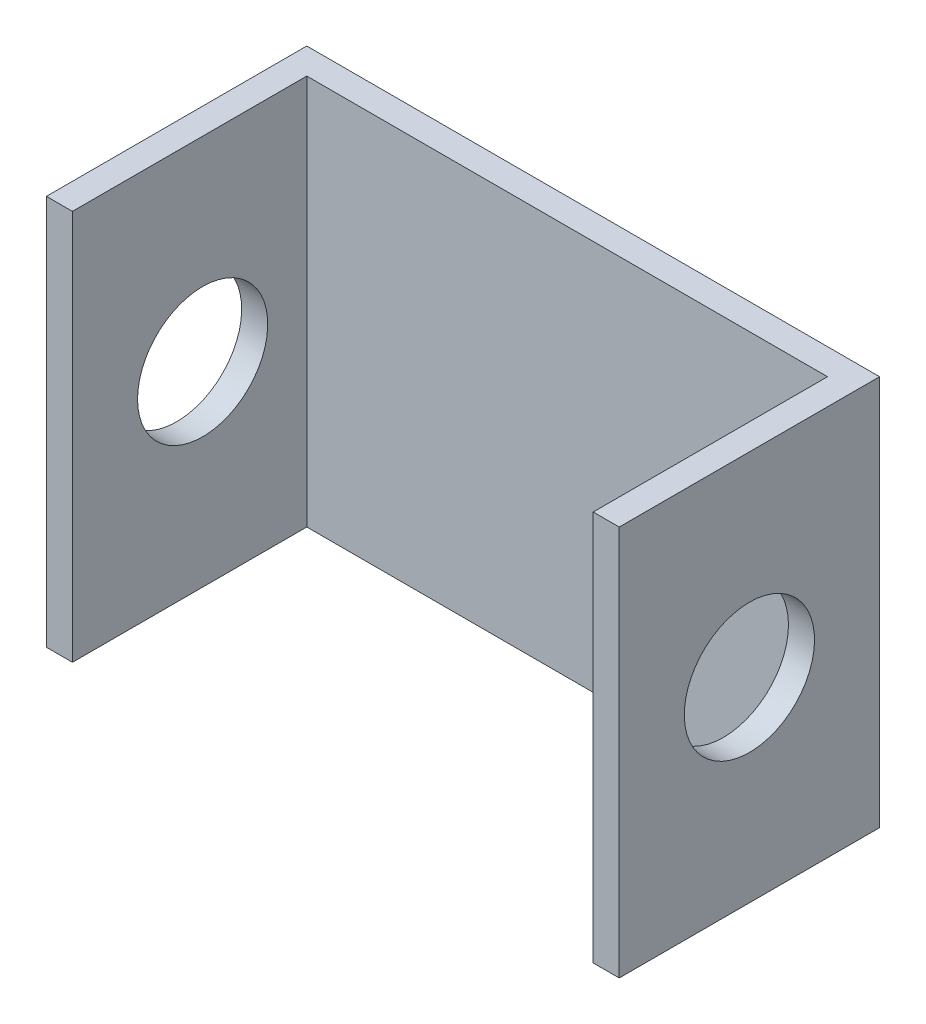
ISO-10303-21;
HEADER;
FILE_DESCRIPTION(('STEP AP214'),'2;1');
FILE_NAME('part.step','',(''),(''),'','','');
FILE_SCHEMA(('AUTOMOTIVE_DESIGN { 1 0 10303 214 1 1 1 1 }'));
ENDSEC;
DATA;
#1=APPLICATION_CONTEXT('core data for automotive mechanical design processes');
#2=APPLICATION_PROTOCOL_DEFINITION('international standard','automotive_design',2000,#1);
#3=PRODUCT_CONTEXT('',#1,'mechanical');
#4=PRODUCT('Part','Part','',(#3));
#5=PRODUCT_RELATED_PRODUCT_CATEGORY('part','',(#4));
#6=PRODUCT_DEFINITION_FORMATION('','',#4);
#7=PRODUCT_DEFINITION_CONTEXT('part definition',#1,'design');
#8=PRODUCT_DEFINITION('design','',#6,#7);
#9=PRODUCT_DEFINITION_SHAPE('','',#8);
#10=(LENGTH_UNIT() NAMED_UNIT(*) SI_UNIT(.MILLI.,.METRE.));
#11=(NAMED_UNIT(*) PLANE_ANGLE_UNIT() SI_UNIT($,.RADIAN.));
#12=(NAMED_UNIT(*) SI_UNIT($,.STERADIAN.) SOLID_ANGLE_UNIT());
#13=UNCERTAINTY_MEASURE_WITH_UNIT(LENGTH_MEASURE(1.E-05),#10,'distance_accuracy_value','');
#14=(GEOMETRIC_REPRESENTATION_CONTEXT(3) GLOBAL_UNCERTAINTY_ASSIGNED_CONTEXT((#13)) GLOBAL_UNIT_ASSIGNED_CONTEXT((#10,
#11,#12)) REPRESENTATION_CONTEXT('',''));
#15=CARTESIAN_POINT('',(0.,0.,0.));
#16=DIRECTION('',(0.,0.,1.));
#17=DIRECTION('',(1.,0.,0.));
#18=AXIS2_PLACEMENT_3D('',#15,#16,#17);
#19=CARTESIAN_POINT('',(-41.1688311688312,-4.6103896103896,2.));
#20=DIRECTION('',(0.,1.,0.));
#21=DIRECTION('',(-1.,0.,0.));
#22=AXIS2_PLACEMENT_3D('',#19,#20,#21);
#23=PLANE('',#22);
#24=DIRECTION('',(1.,0.,0.));
#25=VECTOR('',#24,1.);
#26=CARTESIAN_POINT('',(-41.1688311688312,-4.6103896103896,0.));
#27=LINE('',#26,#25);
#28=CARTESIAN_POINT('',(-43.1688311688312,-4.6103896103896,0.));
#29=VERTEX_POINT('',#28);
#30=CARTESIAN_POINT('',(0.831168831168835,-4.61038961038958,0.));
#31=VERTEX_POINT('',#30);
#32=EDGE_CURVE('E125',#29,#31,#27,.T.);
#33=ORIENTED_EDGE('',*,*,#32,.T.);
#34=DIRECTION('',(0.,0.,-1.));
#35=VECTOR('',#34,1.);
#36=CARTESIAN_POINT('',(0.831168831168835,-4.61038961038958,0.));
#37=LINE('',#36,#35);
#38=CARTESIAN_POINT('',(0.831168831168835,-4.61038961038958,20.));
#39=VERTEX_POINT('',#38);
#40=EDGE_CURVE('E139',#39,#31,#37,.T.);
#41=ORIENTED_EDGE('',*,*,#40,.F.);
#42=DIRECTION('',(-1.,0.,0.));
#43=VECTOR('',#42,1.);
#44=CARTESIAN_POINT('',(0.831168831168835,-4.61038961038958,20.));
#45=LINE('',#44,#43);
#46=CARTESIAN_POINT('',(-1.16883116883117,-4.61038961038959,20.));
#47=VERTEX_POINT('',#46);
#48=EDGE_CURVE('E155',#39,#47,#45,.T.);
#49=ORIENTED_EDGE('',*,*,#48,.T.);
#50=DIRECTION('',(0.,0.,-1.));
#51=VECTOR('',#50,1.);
#52=CARTESIAN_POINT('',(-1.16883116883117,-4.61038961038959,0.));
#53=LINE('',#52,#51);
#54=CARTESIAN_POINT('',(-1.16883116883117,-4.61038961038959,2.));
#55=VERTEX_POINT('',#54);
#56=EDGE_CURVE('E141',#47,#55,#53,.T.);
#57=ORIENTED_EDGE('',*,*,#56,.T.);
#58=DIRECTION('',(1.,0.,0.));
#59=VECTOR('',#58,1.);
#60=CARTESIAN_POINT('',(-41.1688311688312,-4.6103896103896,2.));
#61=LINE('',#60,#59);
#62=CARTESIAN_POINT('',(-41.1688311688312,-4.6103896103896,2.));
#63=VERTEX_POINT('',#62);
#64=EDGE_CURVE('E196',#63,#55,#61,.T.);
#65=ORIENTED_EDGE('',*,*,#64,.F.);
#66=DIRECTION('',(0.,0.,1.));
#67=VECTOR('',#66,1.);
#68=CARTESIAN_POINT('',(-41.1688311688312,-4.6103896103896,0.));
#69=LINE('',#68,#67);
#70=CARTESIAN_POINT('',(-41.1688311688312,-4.6103896103896,20.));
#71=VERTEX_POINT('',#70);
#72=EDGE_CURVE('E72',#63,#71,#69,.T.);
#73=ORIENTED_EDGE('',*,*,#72,.T.);
#74=DIRECTION('',(1.,0.,0.));
#75=VECTOR('',#74,1.);
#76=CARTESIAN_POINT('',(-43.1688311688312,-4.6103896103896,20.));
#77=LINE('',#76,#75);
#78=CARTESIAN_POINT('',(-43.1688311688312,-4.6103896103896,20.));
#79=VERTEX_POINT('',#78);
#80=EDGE_CURVE('E189',#79,#71,#77,.T.);
#81=ORIENTED_EDGE('',*,*,#80,.F.);
#82=DIRECTION('',(0.,0.,1.));
#83=VECTOR('',#82,1.);
#84=CARTESIAN_POINT('',(-43.1688311688312,-4.6103896103896,0.));
#85=LINE('',#84,#83);
#86=EDGE_CURVE('E167',#29,#79,#85,.T.);
#87=ORIENTED_EDGE('',*,*,#86,.F.);
#88=EDGE_LOOP('',(#33,#41,#49,#57,#65,#73,#81,#87));
#89=FACE_BOUND('',#88,.T.);
#90=ADVANCED_FACE('F47',(#89),#23,.F.);
#91=CARTESIAN_POINT('',(-41.1688311688312,25.3896103896104,2.));
#92=DIRECTION('',(0.,-1.,0.));
#93=DIRECTION('',(0.,0.,-1.));
#94=AXIS2_PLACEMENT_3D('',#91,#92,#93);
#95=PLANE('',#94);
#96=DIRECTION('',(-1.,0.,0.));
#97=VECTOR('',#96,1.);
#98=CARTESIAN_POINT('',(-41.1688311688312,25.3896103896104,0.));
#99=LINE('',#98,#97);
#100=CARTESIAN_POINT('',(0.831168831168821,25.3896103896104,0.));
#101=VERTEX_POINT('',#100);
#102=CARTESIAN_POINT('',(-43.1688311688312,25.3896103896104,0.));
#103=VERTEX_POINT('',#102);
#104=EDGE_CURVE('E50',#101,#103,#99,.T.);
#105=ORIENTED_EDGE('',*,*,#104,.T.);
#106=DIRECTION('',(0.,0.,-1.));
#107=VECTOR('',#106,1.);
#108=CARTESIAN_POINT('',(-43.1688311688312,25.3896103896104,0.));
#109=LINE('',#108,#107);
#110=CARTESIAN_POINT('',(-43.1688311688312,25.3896103896104,20.));
#111=VERTEX_POINT('',#110);
#112=EDGE_CURVE('E174',#111,#103,#109,.T.);
#113=ORIENTED_EDGE('',*,*,#112,.F.);
#114=DIRECTION('',(1.,0.,0.));
#115=VECTOR('',#114,1.);
#116=CARTESIAN_POINT('',(-43.1688311688312,25.3896103896104,20.));
#117=LINE('',#116,#115);
#118=CARTESIAN_POINT('',(-41.1688311688312,25.3896103896104,20.));
#119=VERTEX_POINT('',#118);
#120=EDGE_CURVE('E177',#111,#119,#117,.T.);
#121=ORIENTED_EDGE('',*,*,#120,.T.);
#122=DIRECTION('',(0.,0.,-1.));
#123=VECTOR('',#122,1.);
#124=CARTESIAN_POINT('',(-41.1688311688312,25.3896103896104,0.));
#125=LINE('',#124,#123);
#126=CARTESIAN_POINT('',(-41.1688311688312,25.3896103896104,2.));
#127=VERTEX_POINT('',#126);
#128=EDGE_CURVE('E168',#119,#127,#125,.T.);
#129=ORIENTED_EDGE('',*,*,#128,.T.);
#130=DIRECTION('',(-1.,0.,0.));
#131=VECTOR('',#130,1.);
#132=CARTESIAN_POINT('',(-41.1688311688312,25.3896103896104,2.));
#133=LINE('',#132,#131);
#134=CARTESIAN_POINT('',(-1.16883116883117,25.3896103896104,2.));
#135=VERTEX_POINT('',#134);
#136=EDGE_CURVE('E11',#135,#127,#133,.T.);
#137=ORIENTED_EDGE('',*,*,#136,.F.);
#138=DIRECTION('',(0.,0.,1.));
#139=VECTOR('',#138,1.);
#140=CARTESIAN_POINT('',(-1.16883116883118,25.3896103896104,0.));
#141=LINE('',#140,#139);
#142=CARTESIAN_POINT('',(-1.16883116883118,25.3896103896104,20.));
#143=VERTEX_POINT('',#142);
#144=EDGE_CURVE('E64',#135,#143,#141,.T.);
#145=ORIENTED_EDGE('',*,*,#144,.T.);
#146=DIRECTION('',(-1.,0.,0.));
#147=VECTOR('',#146,1.);
#148=CARTESIAN_POINT('',(0.831168831168821,25.3896103896104,20.));
#149=LINE('',#148,#147);
#150=CARTESIAN_POINT('',(0.831168831168821,25.3896103896104,20.));
#151=VERTEX_POINT('',#150);
#152=EDGE_CURVE('E130',#151,#143,#149,.T.);
#153=ORIENTED_EDGE('',*,*,#152,.F.);
#154=DIRECTION('',(0.,0.,1.));
#155=VECTOR('',#154,1.);
#156=CARTESIAN_POINT('',(0.831168831168821,25.3896103896104,0.));
#157=LINE('',#156,#155);
#158=EDGE_CURVE('E127',#101,#151,#157,.T.);
#159=ORIENTED_EDGE('',*,*,#158,.F.);
#160=EDGE_LOOP('',(#105,#113,#121,#129,#137,#145,#153,#159));
#161=FACE_BOUND('',#160,.T.);
#162=ADVANCED_FACE('F128',(#161),#95,.F.);
#163=CARTESIAN_POINT('',(0.,0.,2.));
#164=DIRECTION('',(0.,0.,1.));
#165=DIRECTION('',(1.,0.,0.));
#166=AXIS2_PLACEMENT_3D('',#163,#164,#165);
#167=PLANE('',#166);
#168=DIRECTION('',(0.,-1.,0.));
#169=VECTOR('',#168,1.);
#170=CARTESIAN_POINT('',(-41.1688311688312,25.3896103896104,2.));
#171=LINE('',#170,#169);
#172=EDGE_CURVE('E124',#127,#63,#171,.T.);
#173=ORIENTED_EDGE('',*,*,#172,.T.);
#174=ORIENTED_EDGE('',*,*,#64,.T.);
#175=DIRECTION('',(0.,1.,0.));
#176=VECTOR('',#175,1.);
#177=CARTESIAN_POINT('',(-1.16883116883117,25.3896103896104,2.));
#178=LINE('',#177,#176);
#179=EDGE_CURVE('E56',#55,#135,#178,.T.);
#180=ORIENTED_EDGE('',*,*,#179,.T.);
#181=ORIENTED_EDGE('',*,*,#136,.T.);
#182=EDGE_LOOP('',(#173,#174,#180,#181));
#183=FACE_BOUND('',#182,.T.);
#184=ADVANCED_FACE('F214',(#183),#167,.T.);
#185=CARTESIAN_POINT('',(0.,0.,0.));
#186=DIRECTION('',(0.,0.,1.));
#187=DIRECTION('',(1.,0.,0.));
#188=AXIS2_PLACEMENT_3D('',#185,#186,#187);
#189=PLANE('',#188);
#190=ORIENTED_EDGE('',*,*,#32,.F.);
#191=DIRECTION('',(0.,-1.,0.));
#192=VECTOR('',#191,1.);
#193=CARTESIAN_POINT('',(-43.1688311688312,25.3896103896104,0.));
#194=LINE('',#193,#192);
#195=EDGE_CURVE('E119',#103,#29,#194,.T.);
#196=ORIENTED_EDGE('',*,*,#195,.F.);
#197=ORIENTED_EDGE('',*,*,#104,.F.);
#198=DIRECTION('',(0.,1.,0.));
#199=VECTOR('',#198,1.);
#200=CARTESIAN_POINT('',(0.831168831168821,25.3896103896104,0.));
#201=LINE('',#200,#199);
#202=EDGE_CURVE('E117',#31,#101,#201,.T.);
#203=ORIENTED_EDGE('',*,*,#202,.F.);
#204=EDGE_LOOP('',(#190,#196,#197,#203));
#205=FACE_BOUND('',#204,.T.);
#206=ADVANCED_FACE('F115',(#205),#189,.F.);
#207=CARTESIAN_POINT('',(-43.1688311688312,25.3896103896104,20.));
#208=DIRECTION('',(0.,0.,-1.));
#209=DIRECTION('',(0.,1.,0.));
#210=AXIS2_PLACEMENT_3D('',#207,#208,#209);
#211=PLANE('',#210);
#212=DIRECTION('',(0.,1.,0.));
#213=VECTOR('',#212,1.);
#214=CARTESIAN_POINT('',(-41.1688311688312,25.3896103896104,20.));
#215=LINE('',#214,#213);
#216=EDGE_CURVE('E180',#71,#119,#215,.T.);
#217=ORIENTED_EDGE('',*,*,#216,.T.);
#218=ORIENTED_EDGE('',*,*,#120,.F.);
#219=DIRECTION('',(0.,1.,0.));
#220=VECTOR('',#219,1.);
#221=CARTESIAN_POINT('',(-43.1688311688312,25.3896103896104,20.));
#222=LINE('',#221,#220);
#223=EDGE_CURVE('E171',#79,#111,#222,.T.);
#224=ORIENTED_EDGE('',*,*,#223,.F.);
#225=ORIENTED_EDGE('',*,*,#80,.T.);
#226=EDGE_LOOP('',(#217,#218,#224,#225));
#227=FACE_BOUND('',#226,.T.);
#228=ADVANCED_FACE('F220',(#227),#211,.F.);
#229=CARTESIAN_POINT('',(-43.1688311688312,0.,0.));
#230=DIRECTION('',(-1.,0.,0.));
#231=DIRECTION('',(0.,0.,1.));
#232=AXIS2_PLACEMENT_3D('',#229,#230,#231);
#233=PLANE('',#232);
#234=CARTESIAN_POINT('',(-43.1688311688312,10.3896103896104,10.));
#235=DIRECTION('',(1.,0.,0.));
#236=DIRECTION('',(0.,1.,0.));
#237=AXIS2_PLACEMENT_3D('',#234,#235,#236);
#238=CIRCLE('',#237,5.);
#239=CARTESIAN_POINT('',(-43.1688311688312,15.3896103896104,10.));
#240=VERTEX_POINT('',#239);
#241=EDGE_CURVE('E343',#240,#240,#238,.T.);
#242=ORIENTED_EDGE('',*,*,#241,.T.);
#243=EDGE_LOOP('',(#242));
#244=FACE_BOUND('',#243,.T.);
#245=ORIENTED_EDGE('',*,*,#195,.T.);
#246=ORIENTED_EDGE('',*,*,#86,.T.);
#247=ORIENTED_EDGE('',*,*,#223,.T.);
#248=ORIENTED_EDGE('',*,*,#112,.T.);
#249=EDGE_LOOP('',(#245,#246,#247,#248));
#250=FACE_BOUND('',#249,.T.);
#251=ADVANCED_FACE('F207',(#244,#250),#233,.T.);
#252=CARTESIAN_POINT('',(-41.1688311688312,0.,0.));
#253=DIRECTION('',(-1.,0.,0.));
#254=DIRECTION('',(0.,0.,1.));
#255=AXIS2_PLACEMENT_3D('',#252,#253,#254);
#256=PLANE('',#255);
#257=CARTESIAN_POINT('',(-41.1688311688312,10.3896103896104,10.));
#258=DIRECTION('',(-1.,0.,0.));
#259=DIRECTION('',(0.,0.,1.));
#260=AXIS2_PLACEMENT_3D('',#257,#258,#259);
#261=CIRCLE('',#260,5.);
#262=CARTESIAN_POINT('',(-41.1688311688312,10.3896103896104,15.));
#263=VERTEX_POINT('',#262);
#264=EDGE_CURVE('E148',#263,#263,#261,.T.);
#265=ORIENTED_EDGE('',*,*,#264,.T.);
#266=EDGE_LOOP('',(#265));
#267=FACE_BOUND('',#266,.T.);
#268=ORIENTED_EDGE('',*,*,#172,.F.);
#269=ORIENTED_EDGE('',*,*,#128,.F.);
#270=ORIENTED_EDGE('',*,*,#216,.F.);
#271=ORIENTED_EDGE('',*,*,#72,.F.);
#272=EDGE_LOOP('',(#268,#269,#270,#271));
#273=FACE_BOUND('',#272,.T.);
#274=ADVANCED_FACE('F212',(#267,#273),#256,.F.);
#275=CARTESIAN_POINT('',(-1.16883116883117,0.,0.));
#276=DIRECTION('',(-1.,0.,0.));
#277=DIRECTION('',(0.,-1.,0.));
#278=AXIS2_PLACEMENT_3D('',#275,#276,#277);
#279=PLANE('',#278);
#280=CARTESIAN_POINT('',(-1.16883116883117,10.3896103896104,10.));
#281=DIRECTION('',(-1.,0.,0.));
#282=DIRECTION('',(0.,-1.,0.));
#283=AXIS2_PLACEMENT_3D('',#280,#281,#282);
#284=CIRCLE('',#283,5.);
#285=CARTESIAN_POINT('',(-1.16883116883117,5.38961038961039,10.));
#286=VERTEX_POINT('',#285);
#287=EDGE_CURVE('E347',#286,#286,#284,.T.);
#288=ORIENTED_EDGE('',*,*,#287,.F.);
#289=EDGE_LOOP('',(#288));
#290=FACE_BOUND('',#289,.T.);
#291=ORIENTED_EDGE('',*,*,#179,.F.);
#292=ORIENTED_EDGE('',*,*,#56,.F.);
#293=DIRECTION('',(0.,-1.,0.));
#294=VECTOR('',#293,1.);
#295=CARTESIAN_POINT('',(-1.16883116883118,25.3896103896104,20.));
#296=LINE('',#295,#294);
#297=EDGE_CURVE('E145',#143,#47,#296,.T.);
#298=ORIENTED_EDGE('',*,*,#297,.F.);
#299=ORIENTED_EDGE('',*,*,#144,.F.);
#300=EDGE_LOOP('',(#291,#292,#298,#299));
#301=FACE_BOUND('',#300,.T.);
#302=ADVANCED_FACE('F219',(#290,#301),#279,.T.);
#303=CARTESIAN_POINT('',(0.831168831168821,25.3896103896104,20.));
#304=DIRECTION('',(0.,0.,-1.));
#305=DIRECTION('',(-1.,0.,0.));
#306=AXIS2_PLACEMENT_3D('',#303,#304,#305);
#307=PLANE('',#306);
#308=ORIENTED_EDGE('',*,*,#297,.T.);
#309=ORIENTED_EDGE('',*,*,#48,.F.);
#310=DIRECTION('',(0.,-1.,0.));
#311=VECTOR('',#310,1.);
#312=CARTESIAN_POINT('',(0.831168831168821,25.3896103896104,20.));
#313=LINE('',#312,#311);
#314=EDGE_CURVE('E134',#151,#39,#313,.T.);
#315=ORIENTED_EDGE('',*,*,#314,.F.);
#316=ORIENTED_EDGE('',*,*,#152,.T.);
#317=EDGE_LOOP('',(#308,#309,#315,#316));
#318=FACE_BOUND('',#317,.T.);
#319=ADVANCED_FACE('F216',(#318),#307,.F.);
#320=CARTESIAN_POINT('',(0.831168831168833,0.,0.));
#321=DIRECTION('',(-1.,0.,0.));
#322=DIRECTION('',(0.,-1.,0.));
#323=AXIS2_PLACEMENT_3D('',#320,#321,#322);
#324=PLANE('',#323);
#325=CARTESIAN_POINT('',(0.831168831168828,10.3896103896104,10.));
#326=DIRECTION('',(1.,0.,0.));
#327=DIRECTION('',(0.,1.,0.));
#328=AXIS2_PLACEMENT_3D('',#325,#326,#327);
#329=CIRCLE('',#328,5.);
#330=CARTESIAN_POINT('',(0.831168831168825,15.3896103896104,10.));
#331=VERTEX_POINT('',#330);
#332=EDGE_CURVE('E352',#331,#331,#329,.T.);
#333=ORIENTED_EDGE('',*,*,#332,.F.);
#334=EDGE_LOOP('',(#333));
#335=FACE_BOUND('',#334,.T.);
#336=ORIENTED_EDGE('',*,*,#202,.T.);
#337=ORIENTED_EDGE('',*,*,#158,.T.);
#338=ORIENTED_EDGE('',*,*,#314,.T.);
#339=ORIENTED_EDGE('',*,*,#40,.T.);
#340=EDGE_LOOP('',(#336,#337,#338,#339));
#341=FACE_BOUND('',#340,.T.);
#342=ADVANCED_FACE('F137',(#335,#341),#324,.F.);
#343=CARTESIAN_POINT('',(-43.1688311688312,10.3896103896104,10.));
#344=DIRECTION('',(1.,0.,0.));
#345=DIRECTION('',(0.,1.,0.));
#346=AXIS2_PLACEMENT_3D('',#343,#344,#345);
#347=CYLINDRICAL_SURFACE('',#346,5.);
#348=ORIENTED_EDGE('',*,*,#287,.T.);
#349=EDGE_LOOP('',(#348));
#350=FACE_BOUND('',#349,.T.);
#351=ORIENTED_EDGE('',*,*,#332,.T.);
#352=EDGE_LOOP('',(#351));
#353=FACE_BOUND('',#352,.T.);
#354=ADVANCED_FACE('F282',(#350,#353),#347,.F.);
#355=ORIENTED_EDGE('',*,*,#241,.F.);
#356=EDGE_LOOP('',(#355));
#357=FACE_BOUND('',#356,.T.);
#358=ORIENTED_EDGE('',*,*,#264,.F.);
#359=EDGE_LOOP('',(#358));
#360=FACE_BOUND('',#359,.T.);
#361=ADVANCED_FACE('F291',(#357,#360),#347,.F.);
#362=CLOSED_SHELL('',(#90,#162,#184,#206,#228,#251,#274,#302,#319,#342,#354,#361));
#363=MANIFOLD_SOLID_BREP('B2',#362);
#364=ADVANCED_BREP_SHAPE_REPRESENTATION('',(#18,#363),#14);
#365=SHAPE_DEFINITION_REPRESENTATION(#9,#364);
ENDSEC;
END-ISO-10303-21;
